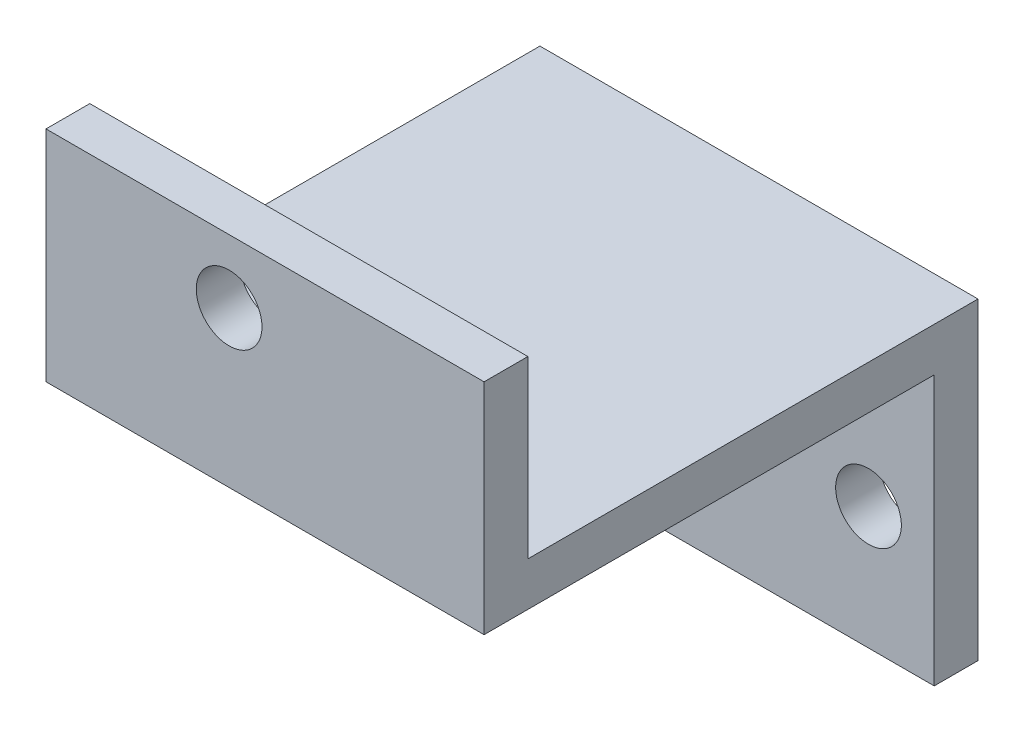
ISO-10303-21;
HEADER;
FILE_DESCRIPTION(('STEP AP214'),'2;1');
FILE_NAME('part.step','',(''),(''),'','','');
FILE_SCHEMA(('AUTOMOTIVE_DESIGN { 1 0 10303 214 1 1 1 1 }'));
ENDSEC;
DATA;
#1=APPLICATION_CONTEXT('core data for automotive mechanical design processes');
#2=APPLICATION_PROTOCOL_DEFINITION('international standard','automotive_design',2000,#1);
#3=PRODUCT_CONTEXT('',#1,'mechanical');
#4=PRODUCT('Part','Part','',(#3));
#5=PRODUCT_RELATED_PRODUCT_CATEGORY('part','',(#4));
#6=PRODUCT_DEFINITION_FORMATION('','',#4);
#7=PRODUCT_DEFINITION_CONTEXT('part definition',#1,'design');
#8=PRODUCT_DEFINITION('design','',#6,#7);
#9=PRODUCT_DEFINITION_SHAPE('','',#8);
#10=(LENGTH_UNIT() NAMED_UNIT(*) SI_UNIT(.MILLI.,.METRE.));
#11=(NAMED_UNIT(*) PLANE_ANGLE_UNIT() SI_UNIT($,.RADIAN.));
#12=(NAMED_UNIT(*) SI_UNIT($,.STERADIAN.) SOLID_ANGLE_UNIT());
#13=UNCERTAINTY_MEASURE_WITH_UNIT(LENGTH_MEASURE(1.E-05),#10,'distance_accuracy_value','');
#14=(GEOMETRIC_REPRESENTATION_CONTEXT(3) GLOBAL_UNCERTAINTY_ASSIGNED_CONTEXT((#13)) GLOBAL_UNIT_ASSIGNED_CONTEXT((#10,
#11,#12)) REPRESENTATION_CONTEXT('',''));
#15=CARTESIAN_POINT('',(0.,0.,0.));
#16=DIRECTION('',(0.,0.,1.));
#17=DIRECTION('',(1.,0.,0.));
#18=AXIS2_PLACEMENT_3D('',#15,#16,#17);
#19=CARTESIAN_POINT('',(0.,14.3,2.));
#20=DIRECTION('',(0.,-1.,0.));
#21=DIRECTION('',(0.,0.,-1.));
#22=AXIS2_PLACEMENT_3D('',#19,#20,#21);
#23=PLANE('',#22);
#24=DIRECTION('',(-1.,0.,0.));
#25=VECTOR('',#24,1.);
#26=CARTESIAN_POINT('',(20.,14.3,20.55));
#27=LINE('',#26,#25);
#28=CARTESIAN_POINT('',(20.,14.3,20.55));
#29=VERTEX_POINT('',#28);
#30=CARTESIAN_POINT('',(0.,14.3,20.55));
#31=VERTEX_POINT('',#30);
#32=EDGE_CURVE('E50',#29,#31,#27,.T.);
#33=ORIENTED_EDGE('',*,*,#32,.F.);
#34=DIRECTION('',(0.,0.,-1.));
#35=VECTOR('',#34,1.);
#36=CARTESIAN_POINT('',(20.,14.3,2.));
#37=LINE('',#36,#35);
#38=CARTESIAN_POINT('',(20.,14.3,0.));
#39=VERTEX_POINT('',#38);
#40=EDGE_CURVE('E123',#29,#39,#37,.T.);
#41=ORIENTED_EDGE('',*,*,#40,.T.);
#42=DIRECTION('',(-1.,0.,0.));
#43=VECTOR('',#42,1.);
#44=CARTESIAN_POINT('',(0.,14.3,0.));
#45=LINE('',#44,#43);
#46=CARTESIAN_POINT('',(0.,14.3,0.));
#47=VERTEX_POINT('',#46);
#48=EDGE_CURVE('E146',#39,#47,#45,.T.);
#49=ORIENTED_EDGE('',*,*,#48,.T.);
#50=DIRECTION('',(0.,0.,-1.));
#51=VECTOR('',#50,1.);
#52=CARTESIAN_POINT('',(0.,14.3,2.));
#53=LINE('',#52,#51);
#54=EDGE_CURVE('E150',#31,#47,#53,.T.);
#55=ORIENTED_EDGE('',*,*,#54,.F.);
#56=EDGE_LOOP('',(#33,#41,#49,#55));
#57=FACE_BOUND('',#56,.T.);
#58=ADVANCED_FACE('F34',(#57),#23,.F.);
#59=CARTESIAN_POINT('',(0.,0.,2.));
#60=DIRECTION('',(0.,0.,-1.));
#61=DIRECTION('',(-1.,0.,0.));
#62=AXIS2_PLACEMENT_3D('',#59,#60,#61);
#63=PLANE('',#62);
#64=CARTESIAN_POINT('',(3.,5.6,2.));
#65=DIRECTION('',(0.,0.,-1.));
#66=DIRECTION('',(-1.,0.,0.));
#67=AXIS2_PLACEMENT_3D('',#64,#65,#66);
#68=CIRCLE('',#67,1.5);
#69=CARTESIAN_POINT('',(1.5,5.6,2.));
#70=VERTEX_POINT('',#69);
#71=EDGE_CURVE('E182',#70,#70,#68,.T.);
#72=ORIENTED_EDGE('',*,*,#71,.T.);
#73=EDGE_LOOP('',(#72));
#74=FACE_BOUND('',#73,.T.);
#75=CARTESIAN_POINT('',(17.,5.6,2.));
#76=DIRECTION('',(0.,0.,-1.));
#77=DIRECTION('',(-1.,0.,0.));
#78=AXIS2_PLACEMENT_3D('',#75,#76,#77);
#79=CIRCLE('',#78,1.5);
#80=CARTESIAN_POINT('',(15.5,5.6,2.));
#81=VERTEX_POINT('',#80);
#82=EDGE_CURVE('E172',#81,#81,#79,.T.);
#83=ORIENTED_EDGE('',*,*,#82,.T.);
#84=EDGE_LOOP('',(#83));
#85=FACE_BOUND('',#84,.T.);
#86=DIRECTION('',(1.,0.,0.));
#87=VECTOR('',#86,1.);
#88=CARTESIAN_POINT('',(0.,12.3,2.));
#89=LINE('',#88,#87);
#90=CARTESIAN_POINT('',(0.,12.3,2.));
#91=VERTEX_POINT('',#90);
#92=CARTESIAN_POINT('',(20.,12.3,2.));
#93=VERTEX_POINT('',#92);
#94=EDGE_CURVE('E58',#91,#93,#89,.T.);
#95=ORIENTED_EDGE('',*,*,#94,.F.);
#96=DIRECTION('',(0.,-1.,0.));
#97=VECTOR('',#96,1.);
#98=CARTESIAN_POINT('',(0.,0.,2.));
#99=LINE('',#98,#97);
#100=CARTESIAN_POINT('',(0.,0.,2.));
#101=VERTEX_POINT('',#100);
#102=EDGE_CURVE('E143',#91,#101,#99,.T.);
#103=ORIENTED_EDGE('',*,*,#102,.T.);
#104=DIRECTION('',(1.,0.,0.));
#105=VECTOR('',#104,1.);
#106=CARTESIAN_POINT('',(0.,0.,2.));
#107=LINE('',#106,#105);
#108=CARTESIAN_POINT('',(20.,0.,2.));
#109=VERTEX_POINT('',#108);
#110=EDGE_CURVE('E145',#101,#109,#107,.T.);
#111=ORIENTED_EDGE('',*,*,#110,.T.);
#112=DIRECTION('',(0.,1.,0.));
#113=VECTOR('',#112,1.);
#114=CARTESIAN_POINT('',(20.,0.,2.));
#115=LINE('',#114,#113);
#116=EDGE_CURVE('E148',#109,#93,#115,.T.);
#117=ORIENTED_EDGE('',*,*,#116,.T.);
#118=EDGE_LOOP('',(#95,#103,#111,#117));
#119=FACE_BOUND('',#118,.T.);
#120=ADVANCED_FACE('F207',(#74,#85,#119),#63,.F.);
#121=CARTESIAN_POINT('',(0.,0.,2.));
#122=DIRECTION('',(1.,0.,0.));
#123=DIRECTION('',(0.,0.,-1.));
#124=AXIS2_PLACEMENT_3D('',#121,#122,#123);
#125=PLANE('',#124);
#126=DIRECTION('',(0.,-1.,0.));
#127=VECTOR('',#126,1.);
#128=CARTESIAN_POINT('',(0.,0.,0.));
#129=LINE('',#128,#127);
#130=CARTESIAN_POINT('',(0.,0.,0.));
#131=VERTEX_POINT('',#130);
#132=EDGE_CURVE('E142',#47,#131,#129,.T.);
#133=ORIENTED_EDGE('',*,*,#132,.T.);
#134=DIRECTION('',(0.,0.,-1.));
#135=VECTOR('',#134,1.);
#136=CARTESIAN_POINT('',(0.,0.,2.));
#137=LINE('',#136,#135);
#138=EDGE_CURVE('E11',#101,#131,#137,.T.);
#139=ORIENTED_EDGE('',*,*,#138,.F.);
#140=ORIENTED_EDGE('',*,*,#102,.F.);
#141=DIRECTION('',(0.,0.,-1.));
#142=VECTOR('',#141,1.);
#143=CARTESIAN_POINT('',(0.,12.3,22.55));
#144=LINE('',#143,#142);
#145=CARTESIAN_POINT('',(0.,12.3,22.55));
#146=VERTEX_POINT('',#145);
#147=EDGE_CURVE('E139',#146,#91,#144,.T.);
#148=ORIENTED_EDGE('',*,*,#147,.F.);
#149=DIRECTION('',(0.,-1.,0.));
#150=VECTOR('',#149,1.);
#151=CARTESIAN_POINT('',(0.,14.3,22.55));
#152=LINE('',#151,#150);
#153=CARTESIAN_POINT('',(0.,22.3,22.55));
#154=VERTEX_POINT('',#153);
#155=EDGE_CURVE('E125',#154,#146,#152,.T.);
#156=ORIENTED_EDGE('',*,*,#155,.F.);
#157=DIRECTION('',(0.,0.,1.));
#158=VECTOR('',#157,1.);
#159=CARTESIAN_POINT('',(0.,22.3,22.55));
#160=LINE('',#159,#158);
#161=CARTESIAN_POINT('',(0.,22.3,20.55));
#162=VERTEX_POINT('',#161);
#163=EDGE_CURVE('E110',#162,#154,#160,.T.);
#164=ORIENTED_EDGE('',*,*,#163,.F.);
#165=DIRECTION('',(0.,-1.,0.));
#166=VECTOR('',#165,1.);
#167=CARTESIAN_POINT('',(0.,22.3,20.55));
#168=LINE('',#167,#166);
#169=EDGE_CURVE('E106',#162,#31,#168,.T.);
#170=ORIENTED_EDGE('',*,*,#169,.T.);
#171=ORIENTED_EDGE('',*,*,#54,.T.);
#172=EDGE_LOOP('',(#133,#139,#140,#148,#156,#164,#170,#171));
#173=FACE_BOUND('',#172,.T.);
#174=ADVANCED_FACE('F36',(#173),#125,.F.);
#175=CARTESIAN_POINT('',(0.,0.,2.));
#176=DIRECTION('',(0.,1.,0.));
#177=DIRECTION('',(0.,0.,1.));
#178=AXIS2_PLACEMENT_3D('',#175,#176,#177);
#179=PLANE('',#178);
#180=DIRECTION('',(1.,0.,0.));
#181=VECTOR('',#180,1.);
#182=CARTESIAN_POINT('',(0.,0.,0.));
#183=LINE('',#182,#181);
#184=CARTESIAN_POINT('',(20.,0.,0.));
#185=VERTEX_POINT('',#184);
#186=EDGE_CURVE('E153',#131,#185,#183,.T.);
#187=ORIENTED_EDGE('',*,*,#186,.T.);
#188=DIRECTION('',(0.,0.,-1.));
#189=VECTOR('',#188,1.);
#190=CARTESIAN_POINT('',(20.,0.,2.));
#191=LINE('',#190,#189);
#192=EDGE_CURVE('E43',#109,#185,#191,.T.);
#193=ORIENTED_EDGE('',*,*,#192,.F.);
#194=ORIENTED_EDGE('',*,*,#110,.F.);
#195=ORIENTED_EDGE('',*,*,#138,.T.);
#196=EDGE_LOOP('',(#187,#193,#194,#195));
#197=FACE_BOUND('',#196,.T.);
#198=ADVANCED_FACE('F217',(#197),#179,.F.);
#199=CARTESIAN_POINT('',(20.,0.,2.));
#200=DIRECTION('',(-1.,0.,0.));
#201=DIRECTION('',(0.,0.,1.));
#202=AXIS2_PLACEMENT_3D('',#199,#200,#201);
#203=PLANE('',#202);
#204=DIRECTION('',(0.,1.,0.));
#205=VECTOR('',#204,1.);
#206=CARTESIAN_POINT('',(20.,0.,0.));
#207=LINE('',#206,#205);
#208=EDGE_CURVE('E155',#185,#39,#207,.T.);
#209=ORIENTED_EDGE('',*,*,#208,.T.);
#210=ORIENTED_EDGE('',*,*,#40,.F.);
#211=DIRECTION('',(0.,-1.,0.));
#212=VECTOR('',#211,1.);
#213=CARTESIAN_POINT('',(20.,22.3,20.55));
#214=LINE('',#213,#212);
#215=CARTESIAN_POINT('',(20.,22.3,20.55));
#216=VERTEX_POINT('',#215);
#217=EDGE_CURVE('E104',#216,#29,#214,.T.);
#218=ORIENTED_EDGE('',*,*,#217,.F.);
#219=DIRECTION('',(0.,0.,-1.));
#220=VECTOR('',#219,1.);
#221=CARTESIAN_POINT('',(20.,22.3,22.55));
#222=LINE('',#221,#220);
#223=CARTESIAN_POINT('',(20.,22.3,22.55));
#224=VERTEX_POINT('',#223);
#225=EDGE_CURVE('E111',#224,#216,#222,.T.);
#226=ORIENTED_EDGE('',*,*,#225,.F.);
#227=DIRECTION('',(0.,1.,0.));
#228=VECTOR('',#227,1.);
#229=CARTESIAN_POINT('',(20.,14.3,22.55));
#230=LINE('',#229,#228);
#231=CARTESIAN_POINT('',(20.,12.3,22.55));
#232=VERTEX_POINT('',#231);
#233=EDGE_CURVE('E134',#232,#224,#230,.T.);
#234=ORIENTED_EDGE('',*,*,#233,.F.);
#235=DIRECTION('',(0.,0.,-1.));
#236=VECTOR('',#235,1.);
#237=CARTESIAN_POINT('',(20.,12.3,22.55));
#238=LINE('',#237,#236);
#239=EDGE_CURVE('E135',#232,#93,#238,.T.);
#240=ORIENTED_EDGE('',*,*,#239,.T.);
#241=ORIENTED_EDGE('',*,*,#116,.F.);
#242=ORIENTED_EDGE('',*,*,#192,.T.);
#243=EDGE_LOOP('',(#209,#210,#218,#226,#234,#240,#241,#242));
#244=FACE_BOUND('',#243,.T.);
#245=ADVANCED_FACE('F122',(#244),#203,.F.);
#246=CARTESIAN_POINT('',(0.,0.,0.));
#247=DIRECTION('',(0.,0.,-1.));
#248=DIRECTION('',(-1.,0.,0.));
#249=AXIS2_PLACEMENT_3D('',#246,#247,#248);
#250=PLANE('',#249);
#251=CARTESIAN_POINT('',(3.,5.6,0.));
#252=DIRECTION('',(0.,0.,-1.));
#253=DIRECTION('',(-1.,0.,0.));
#254=AXIS2_PLACEMENT_3D('',#251,#252,#253);
#255=CIRCLE('',#254,1.5);
#256=CARTESIAN_POINT('',(1.5,5.6,0.));
#257=VERTEX_POINT('',#256);
#258=EDGE_CURVE('E185',#257,#257,#255,.T.);
#259=ORIENTED_EDGE('',*,*,#258,.F.);
#260=EDGE_LOOP('',(#259));
#261=FACE_BOUND('',#260,.T.);
#262=CARTESIAN_POINT('',(17.,5.6,0.));
#263=DIRECTION('',(0.,0.,-1.));
#264=DIRECTION('',(-1.,0.,0.));
#265=AXIS2_PLACEMENT_3D('',#262,#263,#264);
#266=CIRCLE('',#265,1.5);
#267=CARTESIAN_POINT('',(15.5,5.6,0.));
#268=VERTEX_POINT('',#267);
#269=EDGE_CURVE('E179',#268,#268,#266,.T.);
#270=ORIENTED_EDGE('',*,*,#269,.F.);
#271=EDGE_LOOP('',(#270));
#272=FACE_BOUND('',#271,.T.);
#273=ORIENTED_EDGE('',*,*,#132,.F.);
#274=ORIENTED_EDGE('',*,*,#48,.F.);
#275=ORIENTED_EDGE('',*,*,#208,.F.);
#276=ORIENTED_EDGE('',*,*,#186,.F.);
#277=EDGE_LOOP('',(#273,#274,#275,#276));
#278=FACE_BOUND('',#277,.T.);
#279=ADVANCED_FACE('F170',(#261,#272,#278),#250,.T.);
#280=CARTESIAN_POINT('',(0.,12.3,22.55));
#281=DIRECTION('',(0.,1.,0.));
#282=DIRECTION('',(0.,0.,1.));
#283=AXIS2_PLACEMENT_3D('',#280,#281,#282);
#284=PLANE('',#283);
#285=ORIENTED_EDGE('',*,*,#94,.T.);
#286=ORIENTED_EDGE('',*,*,#239,.F.);
#287=DIRECTION('',(1.,0.,0.));
#288=VECTOR('',#287,1.);
#289=CARTESIAN_POINT('',(0.,12.3,22.55));
#290=LINE('',#289,#288);
#291=EDGE_CURVE('E132',#146,#232,#290,.T.);
#292=ORIENTED_EDGE('',*,*,#291,.F.);
#293=ORIENTED_EDGE('',*,*,#147,.T.);
#294=EDGE_LOOP('',(#285,#286,#292,#293));
#295=FACE_BOUND('',#294,.T.);
#296=ADVANCED_FACE('F224',(#295),#284,.F.);
#297=CARTESIAN_POINT('',(0.,0.,22.55));
#298=DIRECTION('',(0.,0.,1.));
#299=DIRECTION('',(1.,0.,0.));
#300=AXIS2_PLACEMENT_3D('',#297,#298,#299);
#301=PLANE('',#300);
#302=CARTESIAN_POINT('',(8.36,19.4,22.55));
#303=DIRECTION('',(0.,0.,1.));
#304=DIRECTION('',(1.,0.,0.));
#305=AXIS2_PLACEMENT_3D('',#302,#303,#304);
#306=CIRCLE('',#305,1.5);
#307=CARTESIAN_POINT('',(9.86,19.4,22.55));
#308=VERTEX_POINT('',#307);
#309=EDGE_CURVE('E188',#308,#308,#306,.T.);
#310=ORIENTED_EDGE('',*,*,#309,.F.);
#311=EDGE_LOOP('',(#310));
#312=FACE_BOUND('',#311,.T.);
#313=ORIENTED_EDGE('',*,*,#155,.T.);
#314=ORIENTED_EDGE('',*,*,#291,.T.);
#315=ORIENTED_EDGE('',*,*,#233,.T.);
#316=DIRECTION('',(1.,0.,0.));
#317=VECTOR('',#316,1.);
#318=CARTESIAN_POINT('',(20.,22.3,22.55));
#319=LINE('',#318,#317);
#320=EDGE_CURVE('E117',#154,#224,#319,.T.);
#321=ORIENTED_EDGE('',*,*,#320,.F.);
#322=EDGE_LOOP('',(#313,#314,#315,#321));
#323=FACE_BOUND('',#322,.T.);
#324=ADVANCED_FACE('F227',(#312,#323),#301,.T.);
#325=CARTESIAN_POINT('',(20.,22.3,20.55));
#326=DIRECTION('',(0.,0.,1.));
#327=DIRECTION('',(1.,0.,0.));
#328=AXIS2_PLACEMENT_3D('',#325,#326,#327);
#329=PLANE('',#328);
#330=CARTESIAN_POINT('',(8.36,19.4,20.55));
#331=DIRECTION('',(0.,0.,1.));
#332=DIRECTION('',(1.,0.,0.));
#333=AXIS2_PLACEMENT_3D('',#330,#331,#332);
#334=CIRCLE('',#333,1.5);
#335=CARTESIAN_POINT('',(9.86,19.4,20.55));
#336=VERTEX_POINT('',#335);
#337=EDGE_CURVE('E38',#336,#336,#334,.T.);
#338=ORIENTED_EDGE('',*,*,#337,.T.);
#339=EDGE_LOOP('',(#338));
#340=FACE_BOUND('',#339,.T.);
#341=ORIENTED_EDGE('',*,*,#32,.T.);
#342=ORIENTED_EDGE('',*,*,#169,.F.);
#343=DIRECTION('',(-1.,0.,0.));
#344=VECTOR('',#343,1.);
#345=CARTESIAN_POINT('',(20.,22.3,20.55));
#346=LINE('',#345,#344);
#347=EDGE_CURVE('E100',#216,#162,#346,.T.);
#348=ORIENTED_EDGE('',*,*,#347,.F.);
#349=ORIENTED_EDGE('',*,*,#217,.T.);
#350=EDGE_LOOP('',(#341,#342,#348,#349));
#351=FACE_BOUND('',#350,.T.);
#352=ADVANCED_FACE('F102',(#340,#351),#329,.F.);
#353=CARTESIAN_POINT('',(0.,22.3,0.));
#354=DIRECTION('',(0.,1.,0.));
#355=DIRECTION('',(0.,0.,1.));
#356=AXIS2_PLACEMENT_3D('',#353,#354,#355);
#357=PLANE('',#356);
#358=ORIENTED_EDGE('',*,*,#225,.T.);
#359=ORIENTED_EDGE('',*,*,#347,.T.);
#360=ORIENTED_EDGE('',*,*,#163,.T.);
#361=ORIENTED_EDGE('',*,*,#320,.T.);
#362=EDGE_LOOP('',(#358,#359,#360,#361));
#363=FACE_BOUND('',#362,.T.);
#364=ADVANCED_FACE('F115',(#363),#357,.T.);
#365=CARTESIAN_POINT('',(17.,5.6,8.));
#366=DIRECTION('',(0.,0.,-1.));
#367=DIRECTION('',(-1.,0.,0.));
#368=AXIS2_PLACEMENT_3D('',#365,#366,#367);
#369=CYLINDRICAL_SURFACE('',#368,1.5);
#370=ORIENTED_EDGE('',*,*,#269,.T.);
#371=EDGE_LOOP('',(#370));
#372=FACE_BOUND('',#371,.T.);
#373=ORIENTED_EDGE('',*,*,#82,.F.);
#374=EDGE_LOOP('',(#373));
#375=FACE_BOUND('',#374,.T.);
#376=ADVANCED_FACE('F203',(#372,#375),#369,.F.);
#377=CARTESIAN_POINT('',(3.,5.6,8.));
#378=DIRECTION('',(0.,0.,-1.));
#379=DIRECTION('',(-1.,0.,0.));
#380=AXIS2_PLACEMENT_3D('',#377,#378,#379);
#381=CYLINDRICAL_SURFACE('',#380,1.5);
#382=ORIENTED_EDGE('',*,*,#258,.T.);
#383=EDGE_LOOP('',(#382));
#384=FACE_BOUND('',#383,.T.);
#385=ORIENTED_EDGE('',*,*,#71,.F.);
#386=EDGE_LOOP('',(#385));
#387=FACE_BOUND('',#386,.T.);
#388=ADVANCED_FACE('F198',(#384,#387),#381,.F.);
#389=CARTESIAN_POINT('',(8.36,19.4,14.55));
#390=DIRECTION('',(0.,0.,1.));
#391=DIRECTION('',(1.,0.,0.));
#392=AXIS2_PLACEMENT_3D('',#389,#390,#391);
#393=CYLINDRICAL_SURFACE('',#392,1.5);
#394=ORIENTED_EDGE('',*,*,#309,.T.);
#395=EDGE_LOOP('',(#394));
#396=FACE_BOUND('',#395,.T.);
#397=ORIENTED_EDGE('',*,*,#337,.F.);
#398=EDGE_LOOP('',(#397));
#399=FACE_BOUND('',#398,.T.);
#400=ADVANCED_FACE('F196',(#396,#399),#393,.F.);
#401=CLOSED_SHELL('',(#58,#120,#174,#198,#245,#279,#296,#324,#352,#364,#376,#388,#400));
#402=MANIFOLD_SOLID_BREP('B2',#401);
#403=ADVANCED_BREP_SHAPE_REPRESENTATION('',(#18,#402),#14);
#404=SHAPE_DEFINITION_REPRESENTATION(#9,#403);
ENDSEC;
END-ISO-10303-21;
